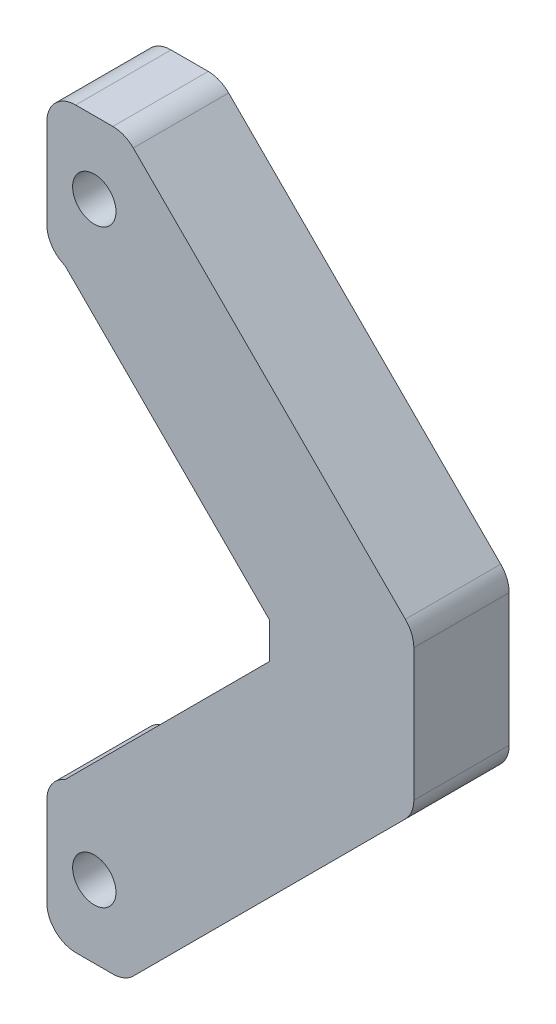
ISO-10303-21;
HEADER;
FILE_DESCRIPTION(('STEP AP214'),'2;1');
FILE_NAME('part.step','',(''),(''),'','','');
FILE_SCHEMA(('AUTOMOTIVE_DESIGN { 1 0 10303 214 1 1 1 1 }'));
ENDSEC;
DATA;
#1=APPLICATION_CONTEXT('core data for automotive mechanical design processes');
#2=APPLICATION_PROTOCOL_DEFINITION('international standard','automotive_design',2000,#1);
#3=PRODUCT_CONTEXT('',#1,'mechanical');
#4=PRODUCT('Part','Part','',(#3));
#5=PRODUCT_RELATED_PRODUCT_CATEGORY('part','',(#4));
#6=PRODUCT_DEFINITION_FORMATION('','',#4);
#7=PRODUCT_DEFINITION_CONTEXT('part definition',#1,'design');
#8=PRODUCT_DEFINITION('design','',#6,#7);
#9=PRODUCT_DEFINITION_SHAPE('','',#8);
#10=(LENGTH_UNIT() NAMED_UNIT(*) SI_UNIT(.MILLI.,.METRE.));
#11=(NAMED_UNIT(*) PLANE_ANGLE_UNIT() SI_UNIT($,.RADIAN.));
#12=(NAMED_UNIT(*) SI_UNIT($,.STERADIAN.) SOLID_ANGLE_UNIT());
#13=UNCERTAINTY_MEASURE_WITH_UNIT(LENGTH_MEASURE(1.E-05),#10,'distance_accuracy_value','');
#14=(GEOMETRIC_REPRESENTATION_CONTEXT(3) GLOBAL_UNCERTAINTY_ASSIGNED_CONTEXT((#13)) GLOBAL_UNIT_ASSIGNED_CONTEXT((#10,
#11,#12)) REPRESENTATION_CONTEXT('',''));
#15=CARTESIAN_POINT('',(0.,0.,0.));
#16=DIRECTION('',(0.,0.,1.));
#17=DIRECTION('',(1.,0.,0.));
#18=AXIS2_PLACEMENT_3D('',#15,#16,#17);
#19=CARTESIAN_POINT('',(-8.12842712474619,23.4,6.6));
#20=DIRECTION('',(0.,0.,1.));
#21=DIRECTION('',(1.,0.,0.));
#22=AXIS2_PLACEMENT_3D('',#19,#20,#21);
#23=PLANE('',#22);
#24=CARTESIAN_POINT('',(-9.4142135624,20.4,6.6));
#25=DIRECTION('',(0.,0.,1.));
#26=DIRECTION('',(1.,0.,0.));
#27=AXIS2_PLACEMENT_3D('',#24,#25,#26);
#28=CIRCLE('',#27,1.5);
#29=CARTESIAN_POINT('',(-7.9142135624,20.4,6.6));
#30=VERTEX_POINT('',#29);
#31=EDGE_CURVE('E194',#30,#30,#28,.T.);
#32=ORIENTED_EDGE('',*,*,#31,.F.);
#33=EDGE_LOOP('',(#32));
#34=FACE_BOUND('',#33,.T.);
#35=CARTESIAN_POINT('',(-8.12842712474619,23.4,6.6));
#36=DIRECTION('',(0.,0.,1.));
#37=DIRECTION('',(1.,0.,0.));
#38=AXIS2_PLACEMENT_3D('',#35,#36,#37);
#39=CIRCLE('',#38,2.);
#40=CARTESIAN_POINT('',(-6.7142135624,24.8142135624,6.6));
#41=VERTEX_POINT('',#40);
#42=CARTESIAN_POINT('',(-8.1284271247,25.4,6.6));
#43=VERTEX_POINT('',#42);
#44=EDGE_CURVE('E225',#41,#43,#39,.T.);
#45=ORIENTED_EDGE('',*,*,#44,.T.);
#46=DIRECTION('',(-1.,0.,0.));
#47=VECTOR('',#46,1.);
#48=CARTESIAN_POINT('',(-8.1284271247,25.4,6.6));
#49=LINE('',#48,#47);
#50=CARTESIAN_POINT('',(-10.7,25.4,6.6));
#51=VERTEX_POINT('',#50);
#52=EDGE_CURVE('E123',#43,#51,#49,.T.);
#53=ORIENTED_EDGE('',*,*,#52,.T.);
#54=CARTESIAN_POINT('',(-10.7,23.4,6.6));
#55=DIRECTION('',(0.,0.,1.));
#56=DIRECTION('',(1.,0.,0.));
#57=AXIS2_PLACEMENT_3D('',#54,#55,#56);
#58=CIRCLE('',#57,2.);
#59=CARTESIAN_POINT('',(-12.7,23.4,6.6));
#60=VERTEX_POINT('',#59);
#61=EDGE_CURVE('E270',#51,#60,#58,.T.);
#62=ORIENTED_EDGE('',*,*,#61,.T.);
#63=DIRECTION('',(0.,-1.,0.));
#64=VECTOR('',#63,1.);
#65=CARTESIAN_POINT('',(-12.7,23.4,6.6));
#66=LINE('',#65,#64);
#67=CARTESIAN_POINT('',(-12.7,17.2572115431,6.6));
#68=VERTEX_POINT('',#67);
#69=EDGE_CURVE('E289',#60,#68,#66,.T.);
#70=ORIENTED_EDGE('',*,*,#69,.T.);
#71=CARTESIAN_POINT('',(-10.7,17.257211543157,6.6));
#72=DIRECTION('',(0.,0.,1.));
#73=DIRECTION('',(1.,0.,0.));
#74=AXIS2_PLACEMENT_3D('',#71,#72,#73);
#75=CIRCLE('',#74,2.);
#76=CARTESIAN_POINT('',(-11.4421356237,15.4,6.6));
#77=VERTEX_POINT('',#76);
#78=EDGE_CURVE('E286',#68,#77,#75,.T.);
#79=ORIENTED_EDGE('',*,*,#78,.T.);
#80=DIRECTION('',(0.707106781186548,-0.707106781186548,0.));
#81=VECTOR('',#80,1.);
#82=CARTESIAN_POINT('',(2.7,1.2578643763,6.6));
#83=LINE('',#82,#81);
#84=CARTESIAN_POINT('',(2.7,1.2578643763,6.6));
#85=VERTEX_POINT('',#84);
#86=EDGE_CURVE('E288',#77,#85,#83,.T.);
#87=ORIENTED_EDGE('',*,*,#86,.T.);
#88=DIRECTION('',(0.,-1.,0.));
#89=VECTOR('',#88,1.);
#90=CARTESIAN_POINT('',(2.7,-1.2578643763,6.6));
#91=LINE('',#90,#89);
#92=CARTESIAN_POINT('',(2.7,-1.2578643763,6.6));
#93=VERTEX_POINT('',#92);
#94=EDGE_CURVE('E291',#85,#93,#91,.T.);
#95=ORIENTED_EDGE('',*,*,#94,.T.);
#96=DIRECTION('',(-0.707106781186548,-0.707106781186548,0.));
#97=VECTOR('',#96,1.);
#98=CARTESIAN_POINT('',(-11.4421356237,-15.4,6.6));
#99=LINE('',#98,#97);
#100=CARTESIAN_POINT('',(-11.4421356237,-15.4,6.6));
#101=VERTEX_POINT('',#100);
#102=EDGE_CURVE('E297',#93,#101,#99,.T.);
#103=ORIENTED_EDGE('',*,*,#102,.T.);
#104=CARTESIAN_POINT('',(-10.7,-17.257211543157,6.6));
#105=DIRECTION('',(0.,0.,1.));
#106=DIRECTION('',(1.,0.,0.));
#107=AXIS2_PLACEMENT_3D('',#104,#105,#106);
#108=CIRCLE('',#107,2.00000000000001);
#109=CARTESIAN_POINT('',(-12.7,-17.2572115431,6.6));
#110=VERTEX_POINT('',#109);
#111=EDGE_CURVE('E299',#101,#110,#108,.T.);
#112=ORIENTED_EDGE('',*,*,#111,.T.);
#113=DIRECTION('',(0.,-1.,0.));
#114=VECTOR('',#113,1.);
#115=CARTESIAN_POINT('',(-12.7,-17.2572115431,6.6));
#116=LINE('',#115,#114);
#117=CARTESIAN_POINT('',(-12.7,-23.4,6.6));
#118=VERTEX_POINT('',#117);
#119=EDGE_CURVE('E301',#110,#118,#116,.T.);
#120=ORIENTED_EDGE('',*,*,#119,.T.);
#121=CARTESIAN_POINT('',(-10.7,-23.4,6.6));
#122=DIRECTION('',(0.,0.,1.));
#123=DIRECTION('',(1.,0.,0.));
#124=AXIS2_PLACEMENT_3D('',#121,#122,#123);
#125=CIRCLE('',#124,2.00000000000001);
#126=CARTESIAN_POINT('',(-10.7,-25.4,6.6));
#127=VERTEX_POINT('',#126);
#128=EDGE_CURVE('E303',#118,#127,#125,.T.);
#129=ORIENTED_EDGE('',*,*,#128,.T.);
#130=DIRECTION('',(1.,0.,0.));
#131=VECTOR('',#130,1.);
#132=CARTESIAN_POINT('',(-10.7,-25.4,6.6));
#133=LINE('',#132,#131);
#134=CARTESIAN_POINT('',(-8.1284271247,-25.4,6.6));
#135=VERTEX_POINT('',#134);
#136=EDGE_CURVE('E305',#127,#135,#133,.T.);
#137=ORIENTED_EDGE('',*,*,#136,.T.);
#138=CARTESIAN_POINT('',(-8.12842712474619,-23.4,6.6));
#139=DIRECTION('',(0.,0.,1.));
#140=DIRECTION('',(1.,0.,0.));
#141=AXIS2_PLACEMENT_3D('',#138,#139,#140);
#142=CIRCLE('',#141,2.00000000000001);
#143=CARTESIAN_POINT('',(-6.7142135624,-24.8142135624,6.6));
#144=VERTEX_POINT('',#143);
#145=EDGE_CURVE('E307',#135,#144,#142,.T.);
#146=ORIENTED_EDGE('',*,*,#145,.T.);
#147=DIRECTION('',(0.707106781186548,0.707106781186547,0.));
#148=VECTOR('',#147,1.);
#149=CARTESIAN_POINT('',(-6.7142135624,-24.8142135624,6.6));
#150=LINE('',#149,#148);
#151=CARTESIAN_POINT('',(12.1142135624,-5.9857864376,6.6));
#152=VERTEX_POINT('',#151);
#153=EDGE_CURVE('E309',#144,#152,#150,.T.);
#154=ORIENTED_EDGE('',*,*,#153,.T.);
#155=CARTESIAN_POINT('',(10.7,-4.5715728752538,6.6));
#156=DIRECTION('',(0.,0.,1.));
#157=DIRECTION('',(1.,0.,0.));
#158=AXIS2_PLACEMENT_3D('',#155,#156,#157);
#159=CIRCLE('',#158,2.00000000000002);
#160=CARTESIAN_POINT('',(12.7,-4.5715728753,6.6));
#161=VERTEX_POINT('',#160);
#162=EDGE_CURVE('E172',#152,#161,#159,.T.);
#163=ORIENTED_EDGE('',*,*,#162,.T.);
#164=DIRECTION('',(0.,1.,0.));
#165=VECTOR('',#164,1.);
#166=CARTESIAN_POINT('',(12.7,-4.5715728753,6.6));
#167=LINE('',#166,#165);
#168=CARTESIAN_POINT('',(12.7,4.5715728753,6.6));
#169=VERTEX_POINT('',#168);
#170=EDGE_CURVE('E166',#161,#169,#167,.T.);
#171=ORIENTED_EDGE('',*,*,#170,.T.);
#172=CARTESIAN_POINT('',(10.7,4.57157287525382,6.6));
#173=DIRECTION('',(0.,0.,1.));
#174=DIRECTION('',(1.,0.,0.));
#175=AXIS2_PLACEMENT_3D('',#172,#173,#174);
#176=CIRCLE('',#175,1.99999999999998);
#177=CARTESIAN_POINT('',(12.1142135624,5.9857864376,6.6));
#178=VERTEX_POINT('',#177);
#179=EDGE_CURVE('E170',#169,#178,#176,.T.);
#180=ORIENTED_EDGE('',*,*,#179,.T.);
#181=DIRECTION('',(-0.707106781186548,0.707106781186547,0.));
#182=VECTOR('',#181,1.);
#183=CARTESIAN_POINT('',(12.1142135624,5.9857864376,6.6));
#184=LINE('',#183,#182);
#185=EDGE_CURVE('E50',#178,#41,#184,.T.);
#186=ORIENTED_EDGE('',*,*,#185,.T.);
#187=EDGE_LOOP('',(#45,#53,#62,#70,#79,#87,#95,#103,#112,#120,#129,#137,#146,#154,#163,#171,
#180,#186));
#188=FACE_BOUND('',#187,.T.);
#189=CARTESIAN_POINT('',(-9.4142135624,-20.4,6.6));
#190=DIRECTION('',(0.,0.,1.));
#191=DIRECTION('',(1.,0.,0.));
#192=AXIS2_PLACEMENT_3D('',#189,#190,#191);
#193=CIRCLE('',#192,1.5);
#194=CARTESIAN_POINT('',(-7.9142135624,-20.4,6.6));
#195=VERTEX_POINT('',#194);
#196=EDGE_CURVE('E352',#195,#195,#193,.T.);
#197=ORIENTED_EDGE('',*,*,#196,.F.);
#198=EDGE_LOOP('',(#197));
#199=FACE_BOUND('',#198,.T.);
#200=ADVANCED_FACE('F33',(#34,#188,#199),#23,.T.);
#201=CARTESIAN_POINT('',(-8.12842712474619,23.4,0.));
#202=DIRECTION('',(0.,0.,1.));
#203=DIRECTION('',(1.,0.,0.));
#204=AXIS2_PLACEMENT_3D('',#201,#202,#203);
#205=PLANE('',#204);
#206=CARTESIAN_POINT('',(-9.4142135624,20.4,0.));
#207=DIRECTION('',(0.,0.,1.));
#208=DIRECTION('',(1.,0.,0.));
#209=AXIS2_PLACEMENT_3D('',#206,#207,#208);
#210=CIRCLE('',#209,1.5);
#211=CARTESIAN_POINT('',(-7.9142135624,20.4,0.));
#212=VERTEX_POINT('',#211);
#213=EDGE_CURVE('E357',#212,#212,#210,.T.);
#214=ORIENTED_EDGE('',*,*,#213,.T.);
#215=EDGE_LOOP('',(#214));
#216=FACE_BOUND('',#215,.T.);
#217=CARTESIAN_POINT('',(-8.12842712474619,23.4,0.));
#218=DIRECTION('',(0.,0.,1.));
#219=DIRECTION('',(1.,0.,0.));
#220=AXIS2_PLACEMENT_3D('',#217,#218,#219);
#221=CIRCLE('',#220,2.);
#222=CARTESIAN_POINT('',(-6.7142135624,24.8142135624,0.));
#223=VERTEX_POINT('',#222);
#224=CARTESIAN_POINT('',(-8.1284271247,25.4,0.));
#225=VERTEX_POINT('',#224);
#226=EDGE_CURVE('E190',#223,#225,#221,.T.);
#227=ORIENTED_EDGE('',*,*,#226,.F.);
#228=DIRECTION('',(-0.707106781186548,0.707106781186547,0.));
#229=VECTOR('',#228,1.);
#230=CARTESIAN_POINT('',(12.1142135624,5.9857864376,0.));
#231=LINE('',#230,#229);
#232=CARTESIAN_POINT('',(12.1142135624,5.9857864376,0.));
#233=VERTEX_POINT('',#232);
#234=EDGE_CURVE('E115',#233,#223,#231,.T.);
#235=ORIENTED_EDGE('',*,*,#234,.F.);
#236=CARTESIAN_POINT('',(10.7,4.57157287525382,0.));
#237=DIRECTION('',(0.,0.,1.));
#238=DIRECTION('',(1.,0.,0.));
#239=AXIS2_PLACEMENT_3D('',#236,#237,#238);
#240=CIRCLE('',#239,1.99999999999998);
#241=CARTESIAN_POINT('',(12.7,4.5715728753,0.));
#242=VERTEX_POINT('',#241);
#243=EDGE_CURVE('E109',#242,#233,#240,.T.);
#244=ORIENTED_EDGE('',*,*,#243,.F.);
#245=DIRECTION('',(0.,1.,0.));
#246=VECTOR('',#245,1.);
#247=CARTESIAN_POINT('',(12.7,-4.5715728753,0.));
#248=LINE('',#247,#246);
#249=CARTESIAN_POINT('',(12.7,-4.5715728753,0.));
#250=VERTEX_POINT('',#249);
#251=EDGE_CURVE('E180',#250,#242,#248,.T.);
#252=ORIENTED_EDGE('',*,*,#251,.F.);
#253=CARTESIAN_POINT('',(10.7,-4.5715728752538,0.));
#254=DIRECTION('',(0.,0.,1.));
#255=DIRECTION('',(1.,0.,0.));
#256=AXIS2_PLACEMENT_3D('',#253,#254,#255);
#257=CIRCLE('',#256,2.00000000000002);
#258=CARTESIAN_POINT('',(12.1142135624,-5.9857864376,0.));
#259=VERTEX_POINT('',#258);
#260=EDGE_CURVE('E220',#259,#250,#257,.T.);
#261=ORIENTED_EDGE('',*,*,#260,.F.);
#262=DIRECTION('',(0.707106781186548,0.707106781186547,0.));
#263=VECTOR('',#262,1.);
#264=CARTESIAN_POINT('',(-6.7142135624,-24.8142135624,0.));
#265=LINE('',#264,#263);
#266=CARTESIAN_POINT('',(-6.7142135624,-24.8142135624,0.));
#267=VERTEX_POINT('',#266);
#268=EDGE_CURVE('E218',#267,#259,#265,.T.);
#269=ORIENTED_EDGE('',*,*,#268,.F.);
#270=CARTESIAN_POINT('',(-8.12842712474619,-23.4,0.));
#271=DIRECTION('',(0.,0.,1.));
#272=DIRECTION('',(1.,0.,0.));
#273=AXIS2_PLACEMENT_3D('',#270,#271,#272);
#274=CIRCLE('',#273,2.00000000000001);
#275=CARTESIAN_POINT('',(-8.1284271247,-25.4,0.));
#276=VERTEX_POINT('',#275);
#277=EDGE_CURVE('E216',#276,#267,#274,.T.);
#278=ORIENTED_EDGE('',*,*,#277,.F.);
#279=DIRECTION('',(1.,0.,0.));
#280=VECTOR('',#279,1.);
#281=CARTESIAN_POINT('',(-10.7,-25.4,0.));
#282=LINE('',#281,#280);
#283=CARTESIAN_POINT('',(-10.7,-25.4,0.));
#284=VERTEX_POINT('',#283);
#285=EDGE_CURVE('E214',#284,#276,#282,.T.);
#286=ORIENTED_EDGE('',*,*,#285,.F.);
#287=CARTESIAN_POINT('',(-10.7,-23.4,0.));
#288=DIRECTION('',(0.,0.,1.));
#289=DIRECTION('',(1.,0.,0.));
#290=AXIS2_PLACEMENT_3D('',#287,#288,#289);
#291=CIRCLE('',#290,2.00000000000001);
#292=CARTESIAN_POINT('',(-12.7,-23.4,0.));
#293=VERTEX_POINT('',#292);
#294=EDGE_CURVE('E212',#293,#284,#291,.T.);
#295=ORIENTED_EDGE('',*,*,#294,.F.);
#296=DIRECTION('',(0.,-1.,0.));
#297=VECTOR('',#296,1.);
#298=CARTESIAN_POINT('',(-12.7,-17.2572115431,0.));
#299=LINE('',#298,#297);
#300=CARTESIAN_POINT('',(-12.7,-17.2572115431,0.));
#301=VERTEX_POINT('',#300);
#302=EDGE_CURVE('E210',#301,#293,#299,.T.);
#303=ORIENTED_EDGE('',*,*,#302,.F.);
#304=CARTESIAN_POINT('',(-10.7,-17.257211543157,0.));
#305=DIRECTION('',(0.,0.,1.));
#306=DIRECTION('',(1.,0.,0.));
#307=AXIS2_PLACEMENT_3D('',#304,#305,#306);
#308=CIRCLE('',#307,2.00000000000001);
#309=CARTESIAN_POINT('',(-11.4421356237,-15.4,0.));
#310=VERTEX_POINT('',#309);
#311=EDGE_CURVE('E208',#310,#301,#308,.T.);
#312=ORIENTED_EDGE('',*,*,#311,.F.);
#313=DIRECTION('',(-0.707106781186548,-0.707106781186548,0.));
#314=VECTOR('',#313,1.);
#315=CARTESIAN_POINT('',(-11.4421356237,-15.4,0.));
#316=LINE('',#315,#314);
#317=CARTESIAN_POINT('',(2.7,-1.2578643763,0.));
#318=VERTEX_POINT('',#317);
#319=EDGE_CURVE('E206',#318,#310,#316,.T.);
#320=ORIENTED_EDGE('',*,*,#319,.F.);
#321=DIRECTION('',(0.,-1.,0.));
#322=VECTOR('',#321,1.);
#323=CARTESIAN_POINT('',(2.7,-1.2578643763,0.));
#324=LINE('',#323,#322);
#325=CARTESIAN_POINT('',(2.7,1.2578643763,0.));
#326=VERTEX_POINT('',#325);
#327=EDGE_CURVE('E204',#326,#318,#324,.T.);
#328=ORIENTED_EDGE('',*,*,#327,.F.);
#329=DIRECTION('',(0.707106781186548,-0.707106781186548,0.));
#330=VECTOR('',#329,1.);
#331=CARTESIAN_POINT('',(2.7,1.2578643763,0.));
#332=LINE('',#331,#330);
#333=CARTESIAN_POINT('',(-11.4421356237,15.4,0.));
#334=VERTEX_POINT('',#333);
#335=EDGE_CURVE('E202',#334,#326,#332,.T.);
#336=ORIENTED_EDGE('',*,*,#335,.F.);
#337=CARTESIAN_POINT('',(-10.7,17.257211543157,0.));
#338=DIRECTION('',(0.,0.,1.));
#339=DIRECTION('',(1.,0.,0.));
#340=AXIS2_PLACEMENT_3D('',#337,#338,#339);
#341=CIRCLE('',#340,2.);
#342=CARTESIAN_POINT('',(-12.7,17.2572115431,0.));
#343=VERTEX_POINT('',#342);
#344=EDGE_CURVE('E200',#343,#334,#341,.T.);
#345=ORIENTED_EDGE('',*,*,#344,.F.);
#346=DIRECTION('',(0.,-1.,0.));
#347=VECTOR('',#346,1.);
#348=CARTESIAN_POINT('',(-12.7,23.4,0.));
#349=LINE('',#348,#347);
#350=CARTESIAN_POINT('',(-12.7,23.4,0.));
#351=VERTEX_POINT('',#350);
#352=EDGE_CURVE('E198',#351,#343,#349,.T.);
#353=ORIENTED_EDGE('',*,*,#352,.F.);
#354=CARTESIAN_POINT('',(-10.7,23.4,0.));
#355=DIRECTION('',(0.,0.,1.));
#356=DIRECTION('',(1.,0.,0.));
#357=AXIS2_PLACEMENT_3D('',#354,#355,#356);
#358=CIRCLE('',#357,2.);
#359=CARTESIAN_POINT('',(-10.7,25.4,0.));
#360=VERTEX_POINT('',#359);
#361=EDGE_CURVE('E196',#360,#351,#358,.T.);
#362=ORIENTED_EDGE('',*,*,#361,.F.);
#363=DIRECTION('',(-1.,0.,0.));
#364=VECTOR('',#363,1.);
#365=CARTESIAN_POINT('',(-8.1284271247,25.4,0.));
#366=LINE('',#365,#364);
#367=EDGE_CURVE('E193',#225,#360,#366,.T.);
#368=ORIENTED_EDGE('',*,*,#367,.F.);
#369=EDGE_LOOP('',(#227,#235,#244,#252,#261,#269,#278,#286,#295,#303,#312,#320,#328,#336,#345,
#353,#362,#368));
#370=FACE_BOUND('',#369,.T.);
#371=CARTESIAN_POINT('',(-9.4142135624,-20.4,0.));
#372=DIRECTION('',(0.,0.,1.));
#373=DIRECTION('',(1.,0.,0.));
#374=AXIS2_PLACEMENT_3D('',#371,#372,#373);
#375=CIRCLE('',#374,1.5);
#376=CARTESIAN_POINT('',(-7.9142135624,-20.4,0.));
#377=VERTEX_POINT('',#376);
#378=EDGE_CURVE('E355',#377,#377,#375,.T.);
#379=ORIENTED_EDGE('',*,*,#378,.T.);
#380=EDGE_LOOP('',(#379));
#381=FACE_BOUND('',#380,.T.);
#382=ADVANCED_FACE('F274',(#216,#370,#381),#205,.F.);
#383=CARTESIAN_POINT('',(-8.12842712474619,23.4,6.6));
#384=DIRECTION('',(0.,0.,-1.));
#385=DIRECTION('',(-1.,0.,0.));
#386=AXIS2_PLACEMENT_3D('',#383,#384,#385);
#387=CYLINDRICAL_SURFACE('',#386,2.);
#388=ORIENTED_EDGE('',*,*,#226,.T.);
#389=DIRECTION('',(0.,0.,-1.));
#390=VECTOR('',#389,1.);
#391=CARTESIAN_POINT('',(-8.1284271247,25.4,6.6));
#392=LINE('',#391,#390);
#393=EDGE_CURVE('E11',#43,#225,#392,.T.);
#394=ORIENTED_EDGE('',*,*,#393,.F.);
#395=ORIENTED_EDGE('',*,*,#44,.F.);
#396=DIRECTION('',(0.,0.,-1.));
#397=VECTOR('',#396,1.);
#398=CARTESIAN_POINT('',(-6.7142135624,24.8142135624,6.6));
#399=LINE('',#398,#397);
#400=EDGE_CURVE('E186',#41,#223,#399,.T.);
#401=ORIENTED_EDGE('',*,*,#400,.T.);
#402=EDGE_LOOP('',(#388,#394,#395,#401));
#403=FACE_BOUND('',#402,.T.);
#404=ADVANCED_FACE('F35',(#403),#387,.T.);
#405=CARTESIAN_POINT('',(-8.1284271247,25.4,6.6));
#406=DIRECTION('',(0.,-1.,0.));
#407=DIRECTION('',(0.,0.,-1.));
#408=AXIS2_PLACEMENT_3D('',#405,#406,#407);
#409=PLANE('',#408);
#410=ORIENTED_EDGE('',*,*,#367,.T.);
#411=DIRECTION('',(0.,0.,-1.));
#412=VECTOR('',#411,1.);
#413=CARTESIAN_POINT('',(-10.7,25.4,6.6));
#414=LINE('',#413,#412);
#415=EDGE_CURVE('E42',#51,#360,#414,.T.);
#416=ORIENTED_EDGE('',*,*,#415,.F.);
#417=ORIENTED_EDGE('',*,*,#52,.F.);
#418=ORIENTED_EDGE('',*,*,#393,.T.);
#419=EDGE_LOOP('',(#410,#416,#417,#418));
#420=FACE_BOUND('',#419,.T.);
#421=ADVANCED_FACE('F510',(#420),#409,.F.);
#422=CARTESIAN_POINT('',(-10.7,23.4,6.6));
#423=DIRECTION('',(0.,0.,-1.));
#424=DIRECTION('',(-1.,0.,0.));
#425=AXIS2_PLACEMENT_3D('',#422,#423,#424);
#426=CYLINDRICAL_SURFACE('',#425,2.);
#427=ORIENTED_EDGE('',*,*,#361,.T.);
#428=DIRECTION('',(0.,0.,-1.));
#429=VECTOR('',#428,1.);
#430=CARTESIAN_POINT('',(-12.7,23.4,6.6));
#431=LINE('',#430,#429);
#432=EDGE_CURVE('E262',#60,#351,#431,.T.);
#433=ORIENTED_EDGE('',*,*,#432,.F.);
#434=ORIENTED_EDGE('',*,*,#61,.F.);
#435=ORIENTED_EDGE('',*,*,#415,.T.);
#436=EDGE_LOOP('',(#427,#433,#434,#435));
#437=FACE_BOUND('',#436,.T.);
#438=ADVANCED_FACE('F268',(#437),#426,.T.);
#439=CARTESIAN_POINT('',(-12.7,23.4,6.6));
#440=DIRECTION('',(1.,0.,0.));
#441=DIRECTION('',(0.,0.,-1.));
#442=AXIS2_PLACEMENT_3D('',#439,#440,#441);
#443=PLANE('',#442);
#444=ORIENTED_EDGE('',*,*,#352,.T.);
#445=DIRECTION('',(0.,0.,-1.));
#446=VECTOR('',#445,1.);
#447=CARTESIAN_POINT('',(-12.7,17.2572115431,6.6));
#448=LINE('',#447,#446);
#449=EDGE_CURVE('E259',#68,#343,#448,.T.);
#450=ORIENTED_EDGE('',*,*,#449,.F.);
#451=ORIENTED_EDGE('',*,*,#69,.F.);
#452=ORIENTED_EDGE('',*,*,#432,.T.);
#453=EDGE_LOOP('',(#444,#450,#451,#452));
#454=FACE_BOUND('',#453,.T.);
#455=ADVANCED_FACE('F280',(#454),#443,.F.);
#456=CARTESIAN_POINT('',(-10.7,17.257211543157,6.6));
#457=DIRECTION('',(0.,0.,-1.));
#458=DIRECTION('',(-1.,0.,0.));
#459=AXIS2_PLACEMENT_3D('',#456,#457,#458);
#460=CYLINDRICAL_SURFACE('',#459,2.);
#461=ORIENTED_EDGE('',*,*,#344,.T.);
#462=DIRECTION('',(0.,0.,-1.));
#463=VECTOR('',#462,1.);
#464=CARTESIAN_POINT('',(-11.4421356237,15.4,6.6));
#465=LINE('',#464,#463);
#466=EDGE_CURVE('E256',#77,#334,#465,.T.);
#467=ORIENTED_EDGE('',*,*,#466,.F.);
#468=ORIENTED_EDGE('',*,*,#78,.F.);
#469=ORIENTED_EDGE('',*,*,#449,.T.);
#470=EDGE_LOOP('',(#461,#467,#468,#469));
#471=FACE_BOUND('',#470,.T.);
#472=ADVANCED_FACE('F284',(#471),#460,.T.);
#473=CARTESIAN_POINT('',(2.7,1.2578643763,6.6));
#474=DIRECTION('',(0.707106781186548,0.707106781186548,0.));
#475=DIRECTION('',(-0.707106781186548,0.707106781186548,0.));
#476=AXIS2_PLACEMENT_3D('',#473,#474,#475);
#477=PLANE('',#476);
#478=ORIENTED_EDGE('',*,*,#335,.T.);
#479=DIRECTION('',(0.,0.,-1.));
#480=VECTOR('',#479,1.);
#481=CARTESIAN_POINT('',(2.7,1.2578643763,6.6));
#482=LINE('',#481,#480);
#483=EDGE_CURVE('E253',#85,#326,#482,.T.);
#484=ORIENTED_EDGE('',*,*,#483,.F.);
#485=ORIENTED_EDGE('',*,*,#86,.F.);
#486=ORIENTED_EDGE('',*,*,#466,.T.);
#487=EDGE_LOOP('',(#478,#484,#485,#486));
#488=FACE_BOUND('',#487,.T.);
#489=ADVANCED_FACE('F475',(#488),#477,.F.);
#490=CARTESIAN_POINT('',(2.7,-1.2578643763,6.6));
#491=DIRECTION('',(1.,0.,0.));
#492=DIRECTION('',(0.,0.,-1.));
#493=AXIS2_PLACEMENT_3D('',#490,#491,#492);
#494=PLANE('',#493);
#495=ORIENTED_EDGE('',*,*,#327,.T.);
#496=DIRECTION('',(0.,0.,-1.));
#497=VECTOR('',#496,1.);
#498=CARTESIAN_POINT('',(2.7,-1.2578643763,6.6));
#499=LINE('',#498,#497);
#500=EDGE_CURVE('E250',#93,#318,#499,.T.);
#501=ORIENTED_EDGE('',*,*,#500,.F.);
#502=ORIENTED_EDGE('',*,*,#94,.F.);
#503=ORIENTED_EDGE('',*,*,#483,.T.);
#504=EDGE_LOOP('',(#495,#501,#502,#503));
#505=FACE_BOUND('',#504,.T.);
#506=ADVANCED_FACE('F465',(#505),#494,.F.);
#507=CARTESIAN_POINT('',(-11.4421356237,-15.4,6.6));
#508=DIRECTION('',(0.707106781186548,-0.707106781186548,0.));
#509=DIRECTION('',(0.707106781186548,0.707106781186548,0.));
#510=AXIS2_PLACEMENT_3D('',#507,#508,#509);
#511=PLANE('',#510);
#512=ORIENTED_EDGE('',*,*,#319,.T.);
#513=DIRECTION('',(0.,0.,-1.));
#514=VECTOR('',#513,1.);
#515=CARTESIAN_POINT('',(-11.4421356237,-15.4,6.6));
#516=LINE('',#515,#514);
#517=EDGE_CURVE('E247',#101,#310,#516,.T.);
#518=ORIENTED_EDGE('',*,*,#517,.F.);
#519=ORIENTED_EDGE('',*,*,#102,.F.);
#520=ORIENTED_EDGE('',*,*,#500,.T.);
#521=EDGE_LOOP('',(#512,#518,#519,#520));
#522=FACE_BOUND('',#521,.T.);
#523=ADVANCED_FACE('F455',(#522),#511,.F.);
#524=CARTESIAN_POINT('',(-10.7,-17.257211543157,6.6));
#525=DIRECTION('',(0.,0.,-1.));
#526=DIRECTION('',(-1.,0.,0.));
#527=AXIS2_PLACEMENT_3D('',#524,#525,#526);
#528=CYLINDRICAL_SURFACE('',#527,2.00000000000001);
#529=ORIENTED_EDGE('',*,*,#311,.T.);
#530=DIRECTION('',(0.,0.,-1.));
#531=VECTOR('',#530,1.);
#532=CARTESIAN_POINT('',(-12.7,-17.2572115431,6.6));
#533=LINE('',#532,#531);
#534=EDGE_CURVE('E244',#110,#301,#533,.T.);
#535=ORIENTED_EDGE('',*,*,#534,.F.);
#536=ORIENTED_EDGE('',*,*,#111,.F.);
#537=ORIENTED_EDGE('',*,*,#517,.T.);
#538=EDGE_LOOP('',(#529,#535,#536,#537));
#539=FACE_BOUND('',#538,.T.);
#540=ADVANCED_FACE('F445',(#539),#528,.T.);
#541=CARTESIAN_POINT('',(-12.7,-17.2572115431,6.6));
#542=DIRECTION('',(1.,0.,0.));
#543=DIRECTION('',(0.,0.,-1.));
#544=AXIS2_PLACEMENT_3D('',#541,#542,#543);
#545=PLANE('',#544);
#546=ORIENTED_EDGE('',*,*,#302,.T.);
#547=DIRECTION('',(0.,0.,-1.));
#548=VECTOR('',#547,1.);
#549=CARTESIAN_POINT('',(-12.7,-23.4,6.6));
#550=LINE('',#549,#548);
#551=EDGE_CURVE('E241',#118,#293,#550,.T.);
#552=ORIENTED_EDGE('',*,*,#551,.F.);
#553=ORIENTED_EDGE('',*,*,#119,.F.);
#554=ORIENTED_EDGE('',*,*,#534,.T.);
#555=EDGE_LOOP('',(#546,#552,#553,#554));
#556=FACE_BOUND('',#555,.T.);
#557=ADVANCED_FACE('F435',(#556),#545,.F.);
#558=CARTESIAN_POINT('',(-10.7,-23.4,6.6));
#559=DIRECTION('',(0.,0.,-1.));
#560=DIRECTION('',(-1.,0.,0.));
#561=AXIS2_PLACEMENT_3D('',#558,#559,#560);
#562=CYLINDRICAL_SURFACE('',#561,2.00000000000001);
#563=ORIENTED_EDGE('',*,*,#294,.T.);
#564=DIRECTION('',(0.,0.,-1.));
#565=VECTOR('',#564,1.);
#566=CARTESIAN_POINT('',(-10.7,-25.4,6.6));
#567=LINE('',#566,#565);
#568=EDGE_CURVE('E238',#127,#284,#567,.T.);
#569=ORIENTED_EDGE('',*,*,#568,.F.);
#570=ORIENTED_EDGE('',*,*,#128,.F.);
#571=ORIENTED_EDGE('',*,*,#551,.T.);
#572=EDGE_LOOP('',(#563,#569,#570,#571));
#573=FACE_BOUND('',#572,.T.);
#574=ADVANCED_FACE('F425',(#573),#562,.T.);
#575=CARTESIAN_POINT('',(-10.7,-25.4,6.6));
#576=DIRECTION('',(0.,1.,0.));
#577=DIRECTION('',(0.,0.,1.));
#578=AXIS2_PLACEMENT_3D('',#575,#576,#577);
#579=PLANE('',#578);
#580=ORIENTED_EDGE('',*,*,#285,.T.);
#581=DIRECTION('',(0.,0.,-1.));
#582=VECTOR('',#581,1.);
#583=CARTESIAN_POINT('',(-8.1284271247,-25.4,6.6));
#584=LINE('',#583,#582);
#585=EDGE_CURVE('E235',#135,#276,#584,.T.);
#586=ORIENTED_EDGE('',*,*,#585,.F.);
#587=ORIENTED_EDGE('',*,*,#136,.F.);
#588=ORIENTED_EDGE('',*,*,#568,.T.);
#589=EDGE_LOOP('',(#580,#586,#587,#588));
#590=FACE_BOUND('',#589,.T.);
#591=ADVANCED_FACE('F415',(#590),#579,.F.);
#592=CARTESIAN_POINT('',(-8.12842712474619,-23.4,6.6));
#593=DIRECTION('',(0.,0.,-1.));
#594=DIRECTION('',(-1.,0.,0.));
#595=AXIS2_PLACEMENT_3D('',#592,#593,#594);
#596=CYLINDRICAL_SURFACE('',#595,2.00000000000001);
#597=ORIENTED_EDGE('',*,*,#277,.T.);
#598=DIRECTION('',(0.,0.,-1.));
#599=VECTOR('',#598,1.);
#600=CARTESIAN_POINT('',(-6.7142135624,-24.8142135624,6.6));
#601=LINE('',#600,#599);
#602=EDGE_CURVE('E232',#144,#267,#601,.T.);
#603=ORIENTED_EDGE('',*,*,#602,.F.);
#604=ORIENTED_EDGE('',*,*,#145,.F.);
#605=ORIENTED_EDGE('',*,*,#585,.T.);
#606=EDGE_LOOP('',(#597,#603,#604,#605));
#607=FACE_BOUND('',#606,.T.);
#608=ADVANCED_FACE('F406',(#607),#596,.T.);
#609=CARTESIAN_POINT('',(-6.7142135624,-24.8142135624,6.6));
#610=DIRECTION('',(-0.707106781186547,0.707106781186548,0.));
#611=DIRECTION('',(-0.707106781186548,-0.707106781186547,0.));
#612=AXIS2_PLACEMENT_3D('',#609,#610,#611);
#613=PLANE('',#612);
#614=ORIENTED_EDGE('',*,*,#268,.T.);
#615=DIRECTION('',(0.,0.,-1.));
#616=VECTOR('',#615,1.);
#617=CARTESIAN_POINT('',(12.1142135624,-5.9857864376,6.6));
#618=LINE('',#617,#616);
#619=EDGE_CURVE('E229',#152,#259,#618,.T.);
#620=ORIENTED_EDGE('',*,*,#619,.F.);
#621=ORIENTED_EDGE('',*,*,#153,.F.);
#622=ORIENTED_EDGE('',*,*,#602,.T.);
#623=EDGE_LOOP('',(#614,#620,#621,#622));
#624=FACE_BOUND('',#623,.T.);
#625=ADVANCED_FACE('F315',(#624),#613,.F.);
#626=CARTESIAN_POINT('',(10.7,-4.5715728752538,6.6));
#627=DIRECTION('',(0.,0.,-1.));
#628=DIRECTION('',(-1.,0.,0.));
#629=AXIS2_PLACEMENT_3D('',#626,#627,#628);
#630=CYLINDRICAL_SURFACE('',#629,2.00000000000002);
#631=ORIENTED_EDGE('',*,*,#260,.T.);
#632=DIRECTION('',(0.,0.,-1.));
#633=VECTOR('',#632,1.);
#634=CARTESIAN_POINT('',(12.7,-4.5715728753,6.6));
#635=LINE('',#634,#633);
#636=EDGE_CURVE('E181',#161,#250,#635,.T.);
#637=ORIENTED_EDGE('',*,*,#636,.F.);
#638=ORIENTED_EDGE('',*,*,#162,.F.);
#639=ORIENTED_EDGE('',*,*,#619,.T.);
#640=EDGE_LOOP('',(#631,#637,#638,#639));
#641=FACE_BOUND('',#640,.T.);
#642=ADVANCED_FACE('F319',(#641),#630,.T.);
#643=CARTESIAN_POINT('',(12.7,-4.5715728753,6.6));
#644=DIRECTION('',(-1.,0.,0.));
#645=DIRECTION('',(0.,0.,1.));
#646=AXIS2_PLACEMENT_3D('',#643,#644,#645);
#647=PLANE('',#646);
#648=ORIENTED_EDGE('',*,*,#251,.T.);
#649=DIRECTION('',(0.,0.,-1.));
#650=VECTOR('',#649,1.);
#651=CARTESIAN_POINT('',(12.7,4.5715728753,6.6));
#652=LINE('',#651,#650);
#653=EDGE_CURVE('E177',#169,#242,#652,.T.);
#654=ORIENTED_EDGE('',*,*,#653,.F.);
#655=ORIENTED_EDGE('',*,*,#170,.F.);
#656=ORIENTED_EDGE('',*,*,#636,.T.);
#657=EDGE_LOOP('',(#648,#654,#655,#656));
#658=FACE_BOUND('',#657,.T.);
#659=ADVANCED_FACE('F178',(#658),#647,.F.);
#660=CARTESIAN_POINT('',(10.7,4.57157287525382,6.6));
#661=DIRECTION('',(0.,0.,-1.));
#662=DIRECTION('',(-1.,0.,0.));
#663=AXIS2_PLACEMENT_3D('',#660,#661,#662);
#664=CYLINDRICAL_SURFACE('',#663,1.99999999999998);
#665=ORIENTED_EDGE('',*,*,#243,.T.);
#666=DIRECTION('',(0.,0.,-1.));
#667=VECTOR('',#666,1.);
#668=CARTESIAN_POINT('',(12.1142135624,5.9857864376,6.6));
#669=LINE('',#668,#667);
#670=EDGE_CURVE('E182',#178,#233,#669,.T.);
#671=ORIENTED_EDGE('',*,*,#670,.F.);
#672=ORIENTED_EDGE('',*,*,#179,.F.);
#673=ORIENTED_EDGE('',*,*,#653,.T.);
#674=EDGE_LOOP('',(#665,#671,#672,#673));
#675=FACE_BOUND('',#674,.T.);
#676=ADVANCED_FACE('F184',(#675),#664,.T.);
#677=CARTESIAN_POINT('',(12.1142135624,5.9857864376,6.6));
#678=DIRECTION('',(-0.707106781186547,-0.707106781186548,0.));
#679=DIRECTION('',(0.707106781186548,-0.707106781186547,0.));
#680=AXIS2_PLACEMENT_3D('',#677,#678,#679);
#681=PLANE('',#680);
#682=ORIENTED_EDGE('',*,*,#234,.T.);
#683=ORIENTED_EDGE('',*,*,#400,.F.);
#684=ORIENTED_EDGE('',*,*,#185,.F.);
#685=ORIENTED_EDGE('',*,*,#670,.T.);
#686=EDGE_LOOP('',(#682,#683,#684,#685));
#687=FACE_BOUND('',#686,.T.);
#688=ADVANCED_FACE('F323',(#687),#681,.F.);
#689=CARTESIAN_POINT('',(-9.4142135624,20.4,6.6));
#690=DIRECTION('',(0.,0.,-1.));
#691=DIRECTION('',(-1.,0.,0.));
#692=AXIS2_PLACEMENT_3D('',#689,#690,#691);
#693=CYLINDRICAL_SURFACE('',#692,1.5);
#694=ORIENTED_EDGE('',*,*,#31,.T.);
#695=EDGE_LOOP('',(#694));
#696=FACE_BOUND('',#695,.T.);
#697=ORIENTED_EDGE('',*,*,#213,.F.);
#698=EDGE_LOOP('',(#697));
#699=FACE_BOUND('',#698,.T.);
#700=ADVANCED_FACE('F325',(#696,#699),#693,.F.);
#701=CARTESIAN_POINT('',(-9.4142135624,-20.4,6.6));
#702=DIRECTION('',(0.,0.,-1.));
#703=DIRECTION('',(-1.,0.,0.));
#704=AXIS2_PLACEMENT_3D('',#701,#702,#703);
#705=CYLINDRICAL_SURFACE('',#704,1.5);
#706=ORIENTED_EDGE('',*,*,#196,.T.);
#707=EDGE_LOOP('',(#706));
#708=FACE_BOUND('',#707,.T.);
#709=ORIENTED_EDGE('',*,*,#378,.F.);
#710=EDGE_LOOP('',(#709));
#711=FACE_BOUND('',#710,.T.);
#712=ADVANCED_FACE('F331',(#708,#711),#705,.F.);
#713=CLOSED_SHELL('',(#200,#382,#404,#421,#438,#455,#472,#489,#506,#523,#540,#557,#574,#591,
#608,#625,#642,#659,#676,#688,#700,#712));
#714=MANIFOLD_SOLID_BREP('B2',#713);
#715=ADVANCED_BREP_SHAPE_REPRESENTATION('',(#18,#714),#14);
#716=SHAPE_DEFINITION_REPRESENTATION(#9,#715);
ENDSEC;
END-ISO-10303-21;
